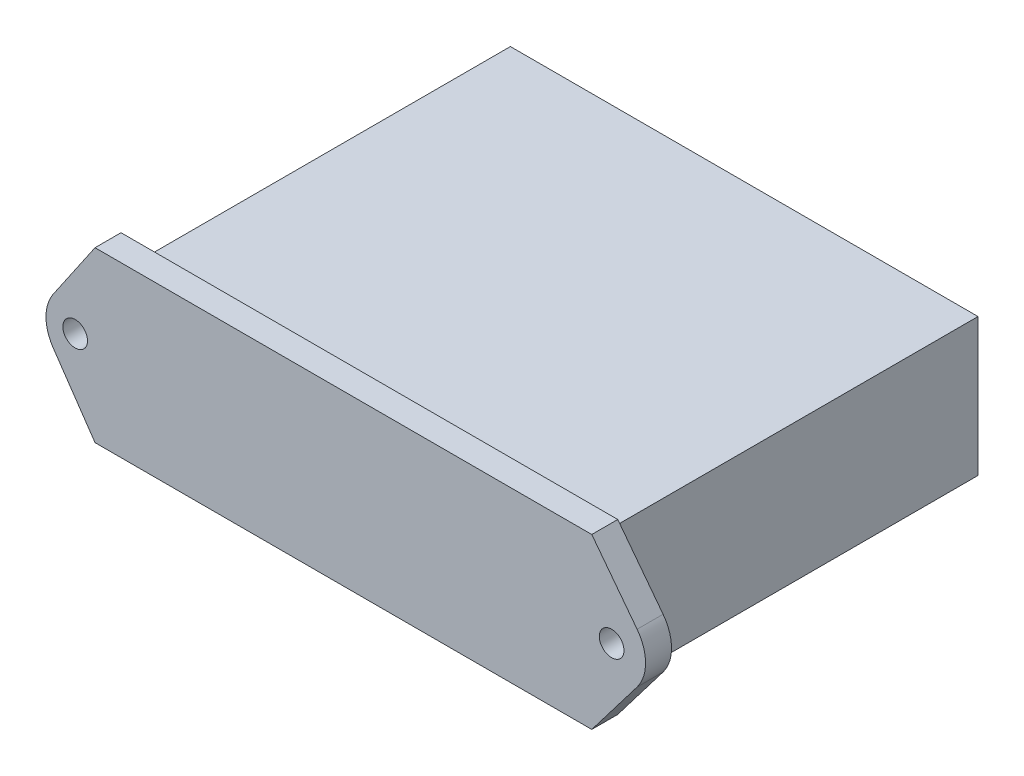
ISO-10303-21;
HEADER;
FILE_DESCRIPTION(('STEP AP214'),'2;1');
FILE_NAME('part.step','',(''),(''),'','','');
FILE_SCHEMA(('AUTOMOTIVE_DESIGN { 1 0 10303 214 1 1 1 1 }'));
ENDSEC;
DATA;
#1=APPLICATION_CONTEXT('core data for automotive mechanical design processes');
#2=APPLICATION_PROTOCOL_DEFINITION('international standard','automotive_design',2000,#1);
#3=PRODUCT_CONTEXT('',#1,'mechanical');
#4=PRODUCT('Part','Part','',(#3));
#5=PRODUCT_RELATED_PRODUCT_CATEGORY('part','',(#4));
#6=PRODUCT_DEFINITION_FORMATION('','',#4);
#7=PRODUCT_DEFINITION_CONTEXT('part definition',#1,'design');
#8=PRODUCT_DEFINITION('design','',#6,#7);
#9=PRODUCT_DEFINITION_SHAPE('','',#8);
#10=(LENGTH_UNIT() NAMED_UNIT(*) SI_UNIT(.MILLI.,.METRE.));
#11=(NAMED_UNIT(*) PLANE_ANGLE_UNIT() SI_UNIT($,.RADIAN.));
#12=(NAMED_UNIT(*) SI_UNIT($,.STERADIAN.) SOLID_ANGLE_UNIT());
#13=UNCERTAINTY_MEASURE_WITH_UNIT(LENGTH_MEASURE(1.E-05),#10,'distance_accuracy_value','');
#14=(GEOMETRIC_REPRESENTATION_CONTEXT(3) GLOBAL_UNCERTAINTY_ASSIGNED_CONTEXT((#13)) GLOBAL_UNIT_ASSIGNED_CONTEXT((#10,
#11,#12)) REPRESENTATION_CONTEXT('',''));
#15=CARTESIAN_POINT('',(0.,0.,0.));
#16=DIRECTION('',(0.,0.,1.));
#17=DIRECTION('',(1.,0.,0.));
#18=AXIS2_PLACEMENT_3D('',#15,#16,#17);
#19=CARTESIAN_POINT('',(0.,0.,-57.2000000016));
#20=DIRECTION('',(0.,0.,1.));
#21=DIRECTION('',(1.,0.,0.));
#22=AXIS2_PLACEMENT_3D('',#19,#20,#21);
#23=PLANE('',#22);
#24=DIRECTION('',(0.,1.,0.));
#25=VECTOR('',#24,1.);
#26=CARTESIAN_POINT('',(0.,10.5999999963,-57.2000000016));
#27=LINE('',#26,#25);
#28=CARTESIAN_POINT('',(0.,0.,-57.2000000016));
#29=VERTEX_POINT('',#28);
#30=CARTESIAN_POINT('',(0.,21.1999999926,-57.2000000016));
#31=VERTEX_POINT('',#30);
#32=EDGE_CURVE('E223',#29,#31,#27,.T.);
#33=ORIENTED_EDGE('',*,*,#32,.T.);
#34=DIRECTION('',(1.,0.,0.));
#35=VECTOR('',#34,1.);
#36=CARTESIAN_POINT('',(35.9999999963,21.1999999926,-57.2000000016));
#37=LINE('',#36,#35);
#38=CARTESIAN_POINT('',(71.9999999926,21.1999999926,-57.2000000016));
#39=VERTEX_POINT('',#38);
#40=EDGE_CURVE('E217',#31,#39,#37,.T.);
#41=ORIENTED_EDGE('',*,*,#40,.T.);
#42=DIRECTION('',(0.,-1.,0.));
#43=VECTOR('',#42,1.);
#44=CARTESIAN_POINT('',(71.9999999926,10.5999999963,-57.2000000016));
#45=LINE('',#44,#43);
#46=CARTESIAN_POINT('',(71.9999999926,0.,-57.2000000016));
#47=VERTEX_POINT('',#46);
#48=EDGE_CURVE('E205',#39,#47,#45,.T.);
#49=ORIENTED_EDGE('',*,*,#48,.T.);
#50=DIRECTION('',(1.,0.,0.));
#51=VECTOR('',#50,1.);
#52=CARTESIAN_POINT('',(35.9999999963,0.,-57.2000000016));
#53=LINE('',#52,#51);
#54=EDGE_CURVE('E131',#29,#47,#53,.T.);
#55=ORIENTED_EDGE('',*,*,#54,.F.);
#56=EDGE_LOOP('',(#33,#41,#49,#55));
#57=FACE_BOUND('',#56,.T.);
#58=ADVANCED_FACE('F16',(#57),#23,.F.);
#59=CARTESIAN_POINT('',(0.,0.,0.));
#60=DIRECTION('',(0.,-1.,0.));
#61=DIRECTION('',(0.,0.,-1.));
#62=AXIS2_PLACEMENT_3D('',#59,#60,#61);
#63=PLANE('',#62);
#64=DIRECTION('',(0.,0.,1.));
#65=VECTOR('',#64,1.);
#66=CARTESIAN_POINT('',(71.9999999926,0.,-28.6000000008));
#67=LINE('',#66,#65);
#68=CARTESIAN_POINT('',(72.0000000041768,-2.29307642752447E-09,0.));
#69=VERTEX_POINT('',#68);
#70=EDGE_CURVE('E200',#47,#69,#67,.T.);
#71=ORIENTED_EDGE('',*,*,#70,.T.);
#72=DIRECTION('',(-1.,0.,0.));
#73=VECTOR('',#72,1.);
#74=CARTESIAN_POINT('',(35.853543482,-9.17230787850221E-09,0.));
#75=LINE('',#74,#73);
#76=CARTESIAN_POINT('',(1.34658928972742E-09,-2.29307707804577E-09,0.));
#77=VERTEX_POINT('',#76);
#78=EDGE_CURVE('E164',#69,#77,#75,.T.);
#79=ORIENTED_EDGE('',*,*,#78,.T.);
#80=DIRECTION('',(0.,0.,-1.));
#81=VECTOR('',#80,1.);
#82=CARTESIAN_POINT('',(0.,0.,-28.6000000008));
#83=LINE('',#82,#81);
#84=EDGE_CURVE('E221',#77,#29,#83,.T.);
#85=ORIENTED_EDGE('',*,*,#84,.T.);
#86=ORIENTED_EDGE('',*,*,#54,.T.);
#87=EDGE_LOOP('',(#71,#79,#85,#86));
#88=FACE_BOUND('',#87,.T.);
#89=ADVANCED_FACE('F234',(#88),#63,.T.);
#90=CARTESIAN_POINT('',(0.,0.,0.));
#91=DIRECTION('',(1.,0.,0.));
#92=DIRECTION('',(0.,0.,-1.));
#93=AXIS2_PLACEMENT_3D('',#90,#91,#92);
#94=PLANE('',#93);
#95=DIRECTION('',(0.,1.,0.));
#96=VECTOR('',#95,1.);
#97=CARTESIAN_POINT('',(5.38635629154793E-09,10.5999999963,0.));
#98=LINE('',#97,#96);
#99=CARTESIAN_POINT('',(1.34658928972742E-09,21.1999999948931,0.));
#100=VERTEX_POINT('',#99);
#101=EDGE_CURVE('E267',#77,#100,#98,.T.);
#102=ORIENTED_EDGE('',*,*,#101,.T.);
#103=DIRECTION('',(0.,0.,-1.));
#104=VECTOR('',#103,1.);
#105=CARTESIAN_POINT('',(0.,21.1999999926,-28.6000000008));
#106=LINE('',#105,#104);
#107=EDGE_CURVE('E213',#100,#31,#106,.T.);
#108=ORIENTED_EDGE('',*,*,#107,.T.);
#109=ORIENTED_EDGE('',*,*,#32,.F.);
#110=ORIENTED_EDGE('',*,*,#84,.F.);
#111=EDGE_LOOP('',(#102,#108,#109,#110));
#112=FACE_BOUND('',#111,.T.);
#113=ADVANCED_FACE('F273',(#112),#94,.F.);
#114=CARTESIAN_POINT('',(0.,21.1999999926,0.));
#115=DIRECTION('',(0.,-1.,0.));
#116=DIRECTION('',(0.,0.,-1.));
#117=AXIS2_PLACEMENT_3D('',#114,#115,#116);
#118=PLANE('',#117);
#119=DIRECTION('',(1.,0.,0.));
#120=VECTOR('',#119,1.);
#121=CARTESIAN_POINT('',(35.853543482,21.2000000017723,0.));
#122=LINE('',#121,#120);
#123=CARTESIAN_POINT('',(72.0000000041768,21.1999999948931,0.));
#124=VERTEX_POINT('',#123);
#125=EDGE_CURVE('E263',#100,#124,#122,.T.);
#126=ORIENTED_EDGE('',*,*,#125,.T.);
#127=DIRECTION('',(0.,0.,-1.));
#128=VECTOR('',#127,1.);
#129=CARTESIAN_POINT('',(71.9999999926,21.1999999926,-28.6000000008));
#130=LINE('',#129,#128);
#131=EDGE_CURVE('E209',#124,#39,#130,.T.);
#132=ORIENTED_EDGE('',*,*,#131,.T.);
#133=ORIENTED_EDGE('',*,*,#40,.F.);
#134=ORIENTED_EDGE('',*,*,#107,.F.);
#135=EDGE_LOOP('',(#126,#132,#133,#134));
#136=FACE_BOUND('',#135,.T.);
#137=ADVANCED_FACE('F251',(#136),#118,.F.);
#138=CARTESIAN_POINT('',(71.9999999926,0.,-57.2000000016));
#139=DIRECTION('',(-1.,0.,0.));
#140=DIRECTION('',(0.,0.,1.));
#141=AXIS2_PLACEMENT_3D('',#138,#139,#140);
#142=PLANE('',#141);
#143=ORIENTED_EDGE('',*,*,#48,.F.);
#144=ORIENTED_EDGE('',*,*,#131,.F.);
#145=DIRECTION('',(0.,-1.,0.));
#146=VECTOR('',#145,1.);
#147=CARTESIAN_POINT('',(72.0000000389072,10.5999999963,0.));
#148=LINE('',#147,#146);
#149=EDGE_CURVE('E159',#124,#69,#148,.T.);
#150=ORIENTED_EDGE('',*,*,#149,.T.);
#151=ORIENTED_EDGE('',*,*,#70,.F.);
#152=EDGE_LOOP('',(#143,#144,#150,#151));
#153=FACE_BOUND('',#152,.T.);
#154=ADVANCED_FACE('F243',(#153),#142,.F.);
#155=CARTESIAN_POINT('',(-9.1959761724,14.186110439,0.));
#156=DIRECTION('',(0.825267651874325,-0.564741801861556,0.));
#157=DIRECTION('',(0.564741801861556,0.825267651874325,0.));
#158=AXIS2_PLACEMENT_3D('',#155,#156,#157);
#159=PLANE('',#158);
#160=DIRECTION('',(0.,0.,-1.));
#161=VECTOR('',#160,1.);
#162=CARTESIAN_POINT('',(-9.19597616850954,14.1861104553399,2.0000000005));
#163=LINE('',#162,#161);
#164=CARTESIAN_POINT('',(-9.19597616757287,14.1861104513813,0.));
#165=VERTEX_POINT('',#164);
#166=CARTESIAN_POINT('',(-9.19597617145983,14.1861104413961,4.000000001));
#167=VERTEX_POINT('',#166);
#168=EDGE_CURVE('E198',#165,#167,#163,.F.);
#169=ORIENTED_EDGE('',*,*,#168,.T.);
#170=DIRECTION('',(-0.564741799149054,-0.825267653730528,0.));
#171=VECTOR('',#170,1.);
#172=CARTESIAN_POINT('',(-2.75392442753907,23.5999999932,4.000000001));
#173=LINE('',#172,#171);
#174=CARTESIAN_POINT('',(-2.75392440776953,23.5999999932,4.000000001));
#175=VERTEX_POINT('',#174);
#176=EDGE_CURVE('E156',#175,#167,#173,.T.);
#177=ORIENTED_EDGE('',*,*,#176,.F.);
#178=DIRECTION('',(0.,0.,-1.));
#179=VECTOR('',#178,1.);
#180=CARTESIAN_POINT('',(-2.753924388,23.5999999932,2.0000000005));
#181=LINE('',#180,#179);
#182=CARTESIAN_POINT('',(-2.753924388,23.5999999932,0.));
#183=VERTEX_POINT('',#182);
#184=EDGE_CURVE('E121',#175,#183,#181,.T.);
#185=ORIENTED_EDGE('',*,*,#184,.T.);
#186=DIRECTION('',(0.564741801861556,0.825267651874325,0.));
#187=VECTOR('',#186,1.);
#188=CARTESIAN_POINT('',(-9.1959761724,14.186110439,0.));
#189=LINE('',#188,#187);
#190=EDGE_CURVE('E136',#183,#165,#189,.F.);
#191=ORIENTED_EDGE('',*,*,#190,.T.);
#192=EDGE_LOOP('',(#169,#177,#185,#191));
#193=FACE_BOUND('',#192,.T.);
#194=ADVANCED_FACE('F307',(#193),#159,.F.);
#195=CARTESIAN_POINT('',(-3.9555265822,10.600000009,4.000000001));
#196=DIRECTION('',(0.,0.,-1.));
#197=DIRECTION('',(-1.,0.,0.));
#198=AXIS2_PLACEMENT_3D('',#195,#196,#197);
#199=CYLINDRICAL_SURFACE('',#198,6.35);
#200=CARTESIAN_POINT('',(-3.9555265822,10.600000009,4.000000001));
#201=DIRECTION('',(0.,0.,-1.));
#202=DIRECTION('',(-1.,0.,0.));
#203=AXIS2_PLACEMENT_3D('',#200,#201,#202);
#204=CIRCLE('',#203,6.35);
#205=CARTESIAN_POINT('',(-9.19597617932406,7.01388956802344,4.000000001));
#206=VERTEX_POINT('',#205);
#207=EDGE_CURVE('E154',#167,#206,#204,.F.);
#208=ORIENTED_EDGE('',*,*,#207,.F.);
#209=ORIENTED_EDGE('',*,*,#168,.F.);
#210=CARTESIAN_POINT('',(-3.9555265822,10.600000009,0.));
#211=DIRECTION('',(0.,0.,-1.));
#212=DIRECTION('',(-1.,0.,0.));
#213=AXIS2_PLACEMENT_3D('',#210,#211,#212);
#214=CIRCLE('',#213,6.35);
#215=CARTESIAN_POINT('',(-9.1959761754371,7.01388955803818,0.));
#216=VERTEX_POINT('',#215);
#217=EDGE_CURVE('E169',#165,#216,#214,.F.);
#218=ORIENTED_EDGE('',*,*,#217,.T.);
#219=DIRECTION('',(0.,0.,1.));
#220=VECTOR('',#219,1.);
#221=CARTESIAN_POINT('',(-9.1959761724,7.0138895536,2.0000000005));
#222=LINE('',#221,#220);
#223=EDGE_CURVE('E194',#216,#206,#222,.T.);
#224=ORIENTED_EDGE('',*,*,#223,.T.);
#225=EDGE_LOOP('',(#208,#209,#218,#224));
#226=FACE_BOUND('',#225,.T.);
#227=ADVANCED_FACE('F303',(#226),#199,.T.);
#228=CARTESIAN_POINT('',(-2.753924388,-2.4000000006,0.));
#229=DIRECTION('',(0.825267651874325,0.564741801861557,0.));
#230=DIRECTION('',(-0.564741801861557,0.825267651874325,0.));
#231=AXIS2_PLACEMENT_3D('',#228,#229,#230);
#232=PLANE('',#231);
#233=ORIENTED_EDGE('',*,*,#223,.F.);
#234=DIRECTION('',(-0.564741801861557,0.825267651874325,0.));
#235=VECTOR('',#234,1.);
#236=CARTESIAN_POINT('',(-2.753924388,-2.4000000006,0.));
#237=LINE('',#236,#235);
#238=CARTESIAN_POINT('',(-2.753924388,-2.4000000006,0.));
#239=VERTEX_POINT('',#238);
#240=EDGE_CURVE('E165',#216,#239,#237,.F.);
#241=ORIENTED_EDGE('',*,*,#240,.T.);
#242=DIRECTION('',(0.,0.,1.));
#243=VECTOR('',#242,1.);
#244=CARTESIAN_POINT('',(-2.753924388,-2.4000000006,2.0000000005));
#245=LINE('',#244,#243);
#246=CARTESIAN_POINT('',(-2.75392440776953,-2.4000000006,4.000000001));
#247=VERTEX_POINT('',#246);
#248=EDGE_CURVE('E188',#239,#247,#245,.T.);
#249=ORIENTED_EDGE('',*,*,#248,.T.);
#250=DIRECTION('',(0.564741799149054,-0.825267653730528,0.));
#251=VECTOR('',#250,1.);
#252=CARTESIAN_POINT('',(-9.1959761620975,7.01388954715515,4.000000001));
#253=LINE('',#252,#251);
#254=EDGE_CURVE('E151',#206,#247,#253,.T.);
#255=ORIENTED_EDGE('',*,*,#254,.F.);
#256=EDGE_LOOP('',(#233,#241,#249,#255));
#257=FACE_BOUND('',#256,.T.);
#258=ADVANCED_FACE('F306',(#257),#232,.F.);
#259=CARTESIAN_POINT('',(-2.753924388,-2.4000000006,0.));
#260=DIRECTION('',(0.,1.,0.));
#261=DIRECTION('',(0.,0.,1.));
#262=AXIS2_PLACEMENT_3D('',#259,#260,#261);
#263=PLANE('',#262);
#264=DIRECTION('',(0.,0.,1.));
#265=VECTOR('',#264,1.);
#266=CARTESIAN_POINT('',(73.7307184514,-2.4000000006,2.0000000005));
#267=LINE('',#266,#265);
#268=CARTESIAN_POINT('',(73.7307184514,-2.4000000006,0.));
#269=VERTEX_POINT('',#268);
#270=CARTESIAN_POINT('',(73.730718440771,-2.4000000006,4.000000001));
#271=VERTEX_POINT('',#270);
#272=EDGE_CURVE('E95',#269,#271,#267,.T.);
#273=ORIENTED_EDGE('',*,*,#272,.T.);
#274=DIRECTION('',(1.,0.,0.));
#275=VECTOR('',#274,1.);
#276=CARTESIAN_POINT('',(35.853543482,-2.4000000006,4.000000001));
#277=LINE('',#276,#275);
#278=EDGE_CURVE('E150',#247,#271,#277,.T.);
#279=ORIENTED_EDGE('',*,*,#278,.F.);
#280=ORIENTED_EDGE('',*,*,#248,.F.);
#281=DIRECTION('',(1.,0.,0.));
#282=VECTOR('',#281,1.);
#283=CARTESIAN_POINT('',(35.853543482,-2.4000000006,0.));
#284=LINE('',#283,#282);
#285=EDGE_CURVE('E119',#239,#269,#284,.T.);
#286=ORIENTED_EDGE('',*,*,#285,.T.);
#287=EDGE_LOOP('',(#273,#279,#280,#286));
#288=FACE_BOUND('',#287,.T.);
#289=ADVANCED_FACE('F317',(#288),#263,.F.);
#290=CARTESIAN_POINT('',(80.7108856442,6.7480590718,0.));
#291=DIRECTION('',(-0.795003478083632,0.606604871258818,0.));
#292=DIRECTION('',(-0.606604871258818,-0.795003478083632,0.));
#293=AXIS2_PLACEMENT_3D('',#290,#291,#292);
#294=PLANE('',#293);
#295=DIRECTION('',(0.,0.,-1.));
#296=VECTOR('',#295,1.);
#297=CARTESIAN_POINT('',(80.7108856582613,6.74805907759458,2.0000000005));
#298=LINE('',#297,#296);
#299=CARTESIAN_POINT('',(80.7108856547998,6.74805907937497,0.));
#300=VERTEX_POINT('',#299);
#301=CARTESIAN_POINT('',(80.7108856529387,6.74805907347042,4.000000001));
#302=VERTEX_POINT('',#301);
#303=EDGE_CURVE('E102',#300,#302,#298,.F.);
#304=ORIENTED_EDGE('',*,*,#303,.T.);
#305=DIRECTION('',(0.606604872716898,0.795003476971086,0.));
#306=VECTOR('',#305,1.);
#307=CARTESIAN_POINT('',(73.7307184301421,-2.4000000006,4.000000001));
#308=LINE('',#307,#306);
#309=EDGE_CURVE('E148',#271,#302,#308,.T.);
#310=ORIENTED_EDGE('',*,*,#309,.F.);
#311=ORIENTED_EDGE('',*,*,#272,.F.);
#312=DIRECTION('',(-0.606604871258818,-0.795003478083632,0.));
#313=VECTOR('',#312,1.);
#314=CARTESIAN_POINT('',(80.7108856442,6.7480590718,0.));
#315=LINE('',#314,#313);
#316=EDGE_CURVE('E20',#269,#300,#315,.F.);
#317=ORIENTED_EDGE('',*,*,#316,.T.);
#318=EDGE_LOOP('',(#304,#310,#311,#317));
#319=FACE_BOUND('',#318,.T.);
#320=ADVANCED_FACE('F118',(#319),#294,.F.);
#321=CARTESIAN_POINT('',(75.6626135716,10.600000009,4.000000001));
#322=DIRECTION('',(0.,0.,-1.));
#323=DIRECTION('',(-1.,0.,0.));
#324=AXIS2_PLACEMENT_3D('',#321,#322,#323);
#325=CYLINDRICAL_SURFACE('',#324,6.34999999999999);
#326=ORIENTED_EDGE('',*,*,#303,.F.);
#327=CARTESIAN_POINT('',(75.6626135716,10.600000009,0.));
#328=DIRECTION('',(0.,0.,-1.));
#329=DIRECTION('',(-1.,0.,0.));
#330=AXIS2_PLACEMENT_3D('',#327,#328,#329);
#331=CIRCLE('',#330,6.34999999999999);
#332=CARTESIAN_POINT('',(80.7108856416446,14.4519409241491,0.));
#333=VERTEX_POINT('',#332);
#334=EDGE_CURVE('E106',#300,#333,#331,.F.);
#335=ORIENTED_EDGE('',*,*,#334,.T.);
#336=DIRECTION('',(0.,0.,1.));
#337=VECTOR('',#336,1.);
#338=CARTESIAN_POINT('',(80.7108856442,14.4519409208,2.0000000005));
#339=LINE('',#338,#337);
#340=CARTESIAN_POINT('',(80.7108856397834,14.4519409300537,4.000000001));
#341=VERTEX_POINT('',#340);
#342=EDGE_CURVE('E108',#333,#341,#339,.T.);
#343=ORIENTED_EDGE('',*,*,#342,.T.);
#344=CARTESIAN_POINT('',(75.6626135716,10.600000009,4.000000001));
#345=DIRECTION('',(0.,0.,-1.));
#346=DIRECTION('',(-1.,0.,0.));
#347=AXIS2_PLACEMENT_3D('',#344,#345,#346);
#348=CIRCLE('',#347,6.34999999999999);
#349=EDGE_CURVE('E107',#302,#341,#348,.F.);
#350=ORIENTED_EDGE('',*,*,#349,.F.);
#351=EDGE_LOOP('',(#326,#335,#343,#350));
#352=FACE_BOUND('',#351,.T.);
#353=ADVANCED_FACE('F104',(#352),#325,.T.);
#354=CARTESIAN_POINT('',(73.7307184514,23.5999999932,0.));
#355=DIRECTION('',(-0.795003478083632,-0.606604871258819,0.));
#356=DIRECTION('',(0.606604871258819,-0.795003478083632,0.));
#357=AXIS2_PLACEMENT_3D('',#354,#355,#356);
#358=PLANE('',#357);
#359=ORIENTED_EDGE('',*,*,#342,.F.);
#360=DIRECTION('',(0.606604871258819,-0.795003478083632,0.));
#361=VECTOR('',#360,1.);
#362=CARTESIAN_POINT('',(73.7307184514,23.5999999932,0.));
#363=LINE('',#362,#361);
#364=CARTESIAN_POINT('',(73.7307184514,23.5999999932,0.));
#365=VERTEX_POINT('',#364);
#366=EDGE_CURVE('E117',#333,#365,#363,.F.);
#367=ORIENTED_EDGE('',*,*,#366,.T.);
#368=DIRECTION('',(0.,0.,1.));
#369=VECTOR('',#368,1.);
#370=CARTESIAN_POINT('',(73.7307184514,23.5999999932,2.0000000005));
#371=LINE('',#370,#369);
#372=CARTESIAN_POINT('',(73.730718440771,23.5999999932,4.000000001));
#373=VERTEX_POINT('',#372);
#374=EDGE_CURVE('E127',#365,#373,#371,.T.);
#375=ORIENTED_EDGE('',*,*,#374,.T.);
#376=DIRECTION('',(-0.606604872716898,0.795003476971086,0.));
#377=VECTOR('',#376,1.);
#378=CARTESIAN_POINT('',(80.7108856505707,14.4519409193815,4.000000001));
#379=LINE('',#378,#377);
#380=EDGE_CURVE('E40',#341,#373,#379,.T.);
#381=ORIENTED_EDGE('',*,*,#380,.F.);
#382=EDGE_LOOP('',(#359,#367,#375,#381));
#383=FACE_BOUND('',#382,.T.);
#384=ADVANCED_FACE('F178',(#383),#358,.F.);
#385=CARTESIAN_POINT('',(-2.753924388,23.5999999932,4.000000001));
#386=DIRECTION('',(0.,-1.,0.));
#387=DIRECTION('',(0.,0.,-1.));
#388=AXIS2_PLACEMENT_3D('',#385,#386,#387);
#389=PLANE('',#388);
#390=ORIENTED_EDGE('',*,*,#184,.F.);
#391=DIRECTION('',(-1.,0.,0.));
#392=VECTOR('',#391,1.);
#393=CARTESIAN_POINT('',(35.853543482,23.5999999932,4.000000001));
#394=LINE('',#393,#392);
#395=EDGE_CURVE('E143',#373,#175,#394,.T.);
#396=ORIENTED_EDGE('',*,*,#395,.F.);
#397=ORIENTED_EDGE('',*,*,#374,.F.);
#398=DIRECTION('',(-1.,0.,0.));
#399=VECTOR('',#398,1.);
#400=CARTESIAN_POINT('',(35.853543482,23.5999999932,0.));
#401=LINE('',#400,#399);
#402=EDGE_CURVE('E133',#365,#183,#401,.T.);
#403=ORIENTED_EDGE('',*,*,#402,.T.);
#404=EDGE_LOOP('',(#390,#396,#397,#403));
#405=FACE_BOUND('',#404,.T.);
#406=ADVANCED_FACE('F299',(#405),#389,.F.);
#407=CARTESIAN_POINT('',(-5.8116029564,10.600000009,0.));
#408=DIRECTION('',(0.,0.,1.));
#409=DIRECTION('',(1.,0.,0.));
#410=AXIS2_PLACEMENT_3D('',#407,#408,#409);
#411=CYLINDRICAL_SURFACE('',#410,1.8999999846);
#412=CARTESIAN_POINT('',(-5.8116029564,10.600000009,4.000000001));
#413=DIRECTION('',(0.,0.,1.));
#414=DIRECTION('',(1.,0.,0.));
#415=AXIS2_PLACEMENT_3D('',#412,#413,#414);
#416=CIRCLE('',#415,1.8999999846);
#417=CARTESIAN_POINT('',(-3.9116029718,10.600000009,4.000000001));
#418=VERTEX_POINT('',#417);
#419=EDGE_CURVE('E140',#418,#418,#416,.F.);
#420=ORIENTED_EDGE('',*,*,#419,.F.);
#421=EDGE_LOOP('',(#420));
#422=FACE_BOUND('',#421,.T.);
#423=CARTESIAN_POINT('',(-5.8116029564,10.600000009,0.));
#424=DIRECTION('',(0.,0.,1.));
#425=DIRECTION('',(1.,0.,0.));
#426=AXIS2_PLACEMENT_3D('',#423,#424,#425);
#427=CIRCLE('',#426,1.8999999846);
#428=CARTESIAN_POINT('',(-3.9116029718,10.600000009,0.));
#429=VERTEX_POINT('',#428);
#430=EDGE_CURVE('E160',#429,#429,#427,.F.);
#431=ORIENTED_EDGE('',*,*,#430,.T.);
#432=EDGE_LOOP('',(#431));
#433=FACE_BOUND('',#432,.T.);
#434=ADVANCED_FACE('F296',(#422,#433),#411,.F.);
#435=CARTESIAN_POINT('',(-10.8594354312,-2.4000000006,0.));
#436=DIRECTION('',(0.,0.,1.));
#437=DIRECTION('',(1.,0.,0.));
#438=AXIS2_PLACEMENT_3D('',#435,#436,#437);
#439=PLANE('',#438);
#440=ORIENTED_EDGE('',*,*,#125,.F.);
#441=ORIENTED_EDGE('',*,*,#101,.F.);
#442=ORIENTED_EDGE('',*,*,#78,.F.);
#443=ORIENTED_EDGE('',*,*,#149,.F.);
#444=EDGE_LOOP('',(#440,#441,#442,#443));
#445=FACE_BOUND('',#444,.T.);
#446=ORIENTED_EDGE('',*,*,#430,.F.);
#447=EDGE_LOOP('',(#446));
#448=FACE_BOUND('',#447,.T.);
#449=CARTESIAN_POINT('',(76.7883970452,10.600000009,0.));
#450=DIRECTION('',(0.,0.,1.));
#451=DIRECTION('',(1.,0.,0.));
#452=AXIS2_PLACEMENT_3D('',#449,#450,#451);
#453=CIRCLE('',#452,1.89999998459998);
#454=CARTESIAN_POINT('',(78.6883970298,10.600000009,0.));
#455=VERTEX_POINT('',#454);
#456=EDGE_CURVE('E27',#455,#455,#453,.F.);
#457=ORIENTED_EDGE('',*,*,#456,.F.);
#458=EDGE_LOOP('',(#457));
#459=FACE_BOUND('',#458,.T.);
#460=ORIENTED_EDGE('',*,*,#217,.F.);
#461=ORIENTED_EDGE('',*,*,#190,.F.);
#462=ORIENTED_EDGE('',*,*,#402,.F.);
#463=ORIENTED_EDGE('',*,*,#366,.F.);
#464=ORIENTED_EDGE('',*,*,#334,.F.);
#465=ORIENTED_EDGE('',*,*,#316,.F.);
#466=ORIENTED_EDGE('',*,*,#285,.F.);
#467=ORIENTED_EDGE('',*,*,#240,.F.);
#468=EDGE_LOOP('',(#460,#461,#462,#463,#464,#465,#466,#467));
#469=FACE_BOUND('',#468,.T.);
#470=ADVANCED_FACE('F112',(#445,#448,#459,#469),#439,.F.);
#471=CARTESIAN_POINT('',(-10.8594354312,-2.4000000006,4.000000001));
#472=DIRECTION('',(0.,0.,1.));
#473=DIRECTION('',(1.,0.,0.));
#474=AXIS2_PLACEMENT_3D('',#471,#472,#473);
#475=PLANE('',#474);
#476=ORIENTED_EDGE('',*,*,#419,.T.);
#477=EDGE_LOOP('',(#476));
#478=FACE_BOUND('',#477,.T.);
#479=CARTESIAN_POINT('',(76.7883970452,10.600000009,4.000000001));
#480=DIRECTION('',(0.,0.,1.));
#481=DIRECTION('',(1.,0.,0.));
#482=AXIS2_PLACEMENT_3D('',#479,#480,#481);
#483=CIRCLE('',#482,1.89999998459998);
#484=CARTESIAN_POINT('',(78.6883970298,10.600000009,4.000000001));
#485=VERTEX_POINT('',#484);
#486=EDGE_CURVE('E11',#485,#485,#483,.T.);
#487=ORIENTED_EDGE('',*,*,#486,.F.);
#488=EDGE_LOOP('',(#487));
#489=FACE_BOUND('',#488,.T.);
#490=ORIENTED_EDGE('',*,*,#380,.T.);
#491=ORIENTED_EDGE('',*,*,#395,.T.);
#492=ORIENTED_EDGE('',*,*,#176,.T.);
#493=ORIENTED_EDGE('',*,*,#207,.T.);
#494=ORIENTED_EDGE('',*,*,#254,.T.);
#495=ORIENTED_EDGE('',*,*,#278,.T.);
#496=ORIENTED_EDGE('',*,*,#309,.T.);
#497=ORIENTED_EDGE('',*,*,#349,.T.);
#498=EDGE_LOOP('',(#490,#491,#492,#493,#494,#495,#496,#497));
#499=FACE_BOUND('',#498,.T.);
#500=ADVANCED_FACE('F18',(#478,#489,#499),#475,.T.);
#501=CARTESIAN_POINT('',(76.7883970452,10.600000009,0.));
#502=DIRECTION('',(0.,0.,1.));
#503=DIRECTION('',(1.,0.,0.));
#504=AXIS2_PLACEMENT_3D('',#501,#502,#503);
#505=CYLINDRICAL_SURFACE('',#504,1.89999998459998);
#506=ORIENTED_EDGE('',*,*,#486,.T.);
#507=EDGE_LOOP('',(#506));
#508=FACE_BOUND('',#507,.T.);
#509=ORIENTED_EDGE('',*,*,#456,.T.);
#510=EDGE_LOOP('',(#509));
#511=FACE_BOUND('',#510,.T.);
#512=ADVANCED_FACE('F285',(#508,#511),#505,.F.);
#513=CLOSED_SHELL('',(#58,#89,#113,#137,#154,#194,#227,#258,#289,#320,#353,#384,#406,#434,#470,
#500,#512));
#514=MANIFOLD_SOLID_BREP('B1',#513);
#515=ADVANCED_BREP_SHAPE_REPRESENTATION('',(#18,#514),#14);
#516=SHAPE_DEFINITION_REPRESENTATION(#9,#515);
ENDSEC;
END-ISO-10303-21;
